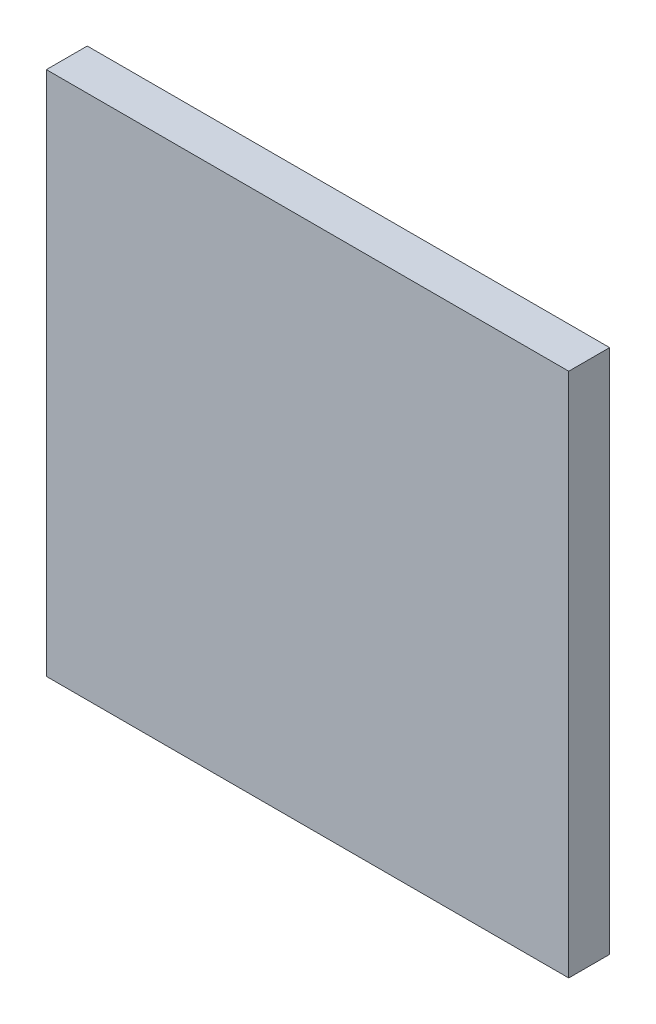
ISO-10303-21;
HEADER;
FILE_DESCRIPTION(('STEP AP214'),'2;1');
FILE_NAME('part.step','',(''),(''),'','','');
FILE_SCHEMA(('AUTOMOTIVE_DESIGN { 1 0 10303 214 1 1 1 1 }'));
ENDSEC;
DATA;
#1=APPLICATION_CONTEXT('core data for automotive mechanical design processes');
#2=APPLICATION_PROTOCOL_DEFINITION('international standard','automotive_design',2000,#1);
#3=PRODUCT_CONTEXT('',#1,'mechanical');
#4=PRODUCT('Part','Part','',(#3));
#5=PRODUCT_RELATED_PRODUCT_CATEGORY('part','',(#4));
#6=PRODUCT_DEFINITION_FORMATION('','',#4);
#7=PRODUCT_DEFINITION_CONTEXT('part definition',#1,'design');
#8=PRODUCT_DEFINITION('design','',#6,#7);
#9=PRODUCT_DEFINITION_SHAPE('','',#8);
#10=(LENGTH_UNIT() NAMED_UNIT(*) SI_UNIT(.MILLI.,.METRE.));
#11=(NAMED_UNIT(*) PLANE_ANGLE_UNIT() SI_UNIT($,.RADIAN.));
#12=(NAMED_UNIT(*) SI_UNIT($,.STERADIAN.) SOLID_ANGLE_UNIT());
#13=UNCERTAINTY_MEASURE_WITH_UNIT(LENGTH_MEASURE(1.E-05),#10,'distance_accuracy_value','');
#14=(GEOMETRIC_REPRESENTATION_CONTEXT(3) GLOBAL_UNCERTAINTY_ASSIGNED_CONTEXT((#13)) GLOBAL_UNIT_ASSIGNED_CONTEXT((#10,
#11,#12)) REPRESENTATION_CONTEXT('',''));
#15=CARTESIAN_POINT('',(0.,0.,0.));
#16=DIRECTION('',(0.,0.,1.));
#17=DIRECTION('',(1.,0.,0.));
#18=AXIS2_PLACEMENT_3D('',#15,#16,#17);
#19=CARTESIAN_POINT('',(-6.4262,-6.4262,1.));
#20=DIRECTION('',(1.,0.,0.));
#21=DIRECTION('',(0.,0.,-1.));
#22=AXIS2_PLACEMENT_3D('',#19,#20,#21);
#23=PLANE('',#22);
#24=DIRECTION('',(0.,-1.,0.));
#25=VECTOR('',#24,1.);
#26=CARTESIAN_POINT('',(-6.4262,-6.4262,0.));
#27=LINE('',#26,#25);
#28=CARTESIAN_POINT('',(-6.4262,6.4262,0.));
#29=VERTEX_POINT('',#28);
#30=CARTESIAN_POINT('',(-6.4262,-6.4262,0.));
#31=VERTEX_POINT('',#30);
#32=EDGE_CURVE('E96',#29,#31,#27,.T.);
#33=ORIENTED_EDGE('',*,*,#32,.T.);
#34=DIRECTION('',(0.,0.,-1.));
#35=VECTOR('',#34,1.);
#36=CARTESIAN_POINT('',(-6.4262,-6.4262,1.));
#37=LINE('',#36,#35);
#38=CARTESIAN_POINT('',(-6.4262,-6.4262,1.));
#39=VERTEX_POINT('',#38);
#40=EDGE_CURVE('E11',#39,#31,#37,.T.);
#41=ORIENTED_EDGE('',*,*,#40,.F.);
#42=DIRECTION('',(0.,-1.,0.));
#43=VECTOR('',#42,1.);
#44=CARTESIAN_POINT('',(-6.4262,-6.4262,1.));
#45=LINE('',#44,#43);
#46=CARTESIAN_POINT('',(-6.4262,6.4262,1.));
#47=VERTEX_POINT('',#46);
#48=EDGE_CURVE('E84',#47,#39,#45,.T.);
#49=ORIENTED_EDGE('',*,*,#48,.F.);
#50=DIRECTION('',(0.,0.,-1.));
#51=VECTOR('',#50,1.);
#52=CARTESIAN_POINT('',(-6.4262,6.4262,1.));
#53=LINE('',#52,#51);
#54=EDGE_CURVE('E92',#47,#29,#53,.T.);
#55=ORIENTED_EDGE('',*,*,#54,.T.);
#56=EDGE_LOOP('',(#33,#41,#49,#55));
#57=FACE_BOUND('',#56,.T.);
#58=ADVANCED_FACE('F33',(#57),#23,.F.);
#59=CARTESIAN_POINT('',(6.35,-6.4262,1.));
#60=DIRECTION('',(0.,1.,0.));
#61=DIRECTION('',(0.,0.,1.));
#62=AXIS2_PLACEMENT_3D('',#59,#60,#61);
#63=PLANE('',#62);
#64=DIRECTION('',(1.,0.,0.));
#65=VECTOR('',#64,1.);
#66=CARTESIAN_POINT('',(6.35,-6.4262,0.));
#67=LINE('',#66,#65);
#68=CARTESIAN_POINT('',(6.35,-6.4262,0.));
#69=VERTEX_POINT('',#68);
#70=EDGE_CURVE('E88',#31,#69,#67,.T.);
#71=ORIENTED_EDGE('',*,*,#70,.T.);
#72=DIRECTION('',(0.,0.,-1.));
#73=VECTOR('',#72,1.);
#74=CARTESIAN_POINT('',(6.35,-6.4262,1.));
#75=LINE('',#74,#73);
#76=CARTESIAN_POINT('',(6.35,-6.4262,1.));
#77=VERTEX_POINT('',#76);
#78=EDGE_CURVE('E41',#77,#69,#75,.T.);
#79=ORIENTED_EDGE('',*,*,#78,.F.);
#80=DIRECTION('',(1.,0.,0.));
#81=VECTOR('',#80,1.);
#82=CARTESIAN_POINT('',(6.35,-6.4262,1.));
#83=LINE('',#82,#81);
#84=EDGE_CURVE('E79',#39,#77,#83,.T.);
#85=ORIENTED_EDGE('',*,*,#84,.F.);
#86=ORIENTED_EDGE('',*,*,#40,.T.);
#87=EDGE_LOOP('',(#71,#79,#85,#86));
#88=FACE_BOUND('',#87,.T.);
#89=ADVANCED_FACE('F87',(#88),#63,.F.);
#90=CARTESIAN_POINT('',(6.35,6.4262,1.));
#91=DIRECTION('',(-1.,0.,0.));
#92=DIRECTION('',(0.,0.,1.));
#93=AXIS2_PLACEMENT_3D('',#90,#91,#92);
#94=PLANE('',#93);
#95=DIRECTION('',(0.,1.,0.));
#96=VECTOR('',#95,1.);
#97=CARTESIAN_POINT('',(6.35,6.4262,0.));
#98=LINE('',#97,#96);
#99=CARTESIAN_POINT('',(6.35,6.4262,0.));
#100=VERTEX_POINT('',#99);
#101=EDGE_CURVE('E66',#69,#100,#98,.T.);
#102=ORIENTED_EDGE('',*,*,#101,.T.);
#103=DIRECTION('',(0.,0.,-1.));
#104=VECTOR('',#103,1.);
#105=CARTESIAN_POINT('',(6.35,6.4262,1.));
#106=LINE('',#105,#104);
#107=CARTESIAN_POINT('',(6.35,6.4262,1.));
#108=VERTEX_POINT('',#107);
#109=EDGE_CURVE('E89',#108,#100,#106,.T.);
#110=ORIENTED_EDGE('',*,*,#109,.F.);
#111=DIRECTION('',(0.,1.,0.));
#112=VECTOR('',#111,1.);
#113=CARTESIAN_POINT('',(6.35,6.4262,1.));
#114=LINE('',#113,#112);
#115=EDGE_CURVE('E82',#77,#108,#114,.T.);
#116=ORIENTED_EDGE('',*,*,#115,.F.);
#117=ORIENTED_EDGE('',*,*,#78,.T.);
#118=EDGE_LOOP('',(#102,#110,#116,#117));
#119=FACE_BOUND('',#118,.T.);
#120=ADVANCED_FACE('F90',(#119),#94,.F.);
#121=CARTESIAN_POINT('',(-6.4262,6.4262,1.));
#122=DIRECTION('',(0.,-1.,0.));
#123=DIRECTION('',(0.,0.,-1.));
#124=AXIS2_PLACEMENT_3D('',#121,#122,#123);
#125=PLANE('',#124);
#126=DIRECTION('',(-1.,0.,0.));
#127=VECTOR('',#126,1.);
#128=CARTESIAN_POINT('',(-6.4262,6.4262,0.));
#129=LINE('',#128,#127);
#130=EDGE_CURVE('E72',#100,#29,#129,.T.);
#131=ORIENTED_EDGE('',*,*,#130,.T.);
#132=ORIENTED_EDGE('',*,*,#54,.F.);
#133=DIRECTION('',(-1.,0.,0.));
#134=VECTOR('',#133,1.);
#135=CARTESIAN_POINT('',(-6.4262,6.4262,1.));
#136=LINE('',#135,#134);
#137=EDGE_CURVE('E49',#108,#47,#136,.T.);
#138=ORIENTED_EDGE('',*,*,#137,.F.);
#139=ORIENTED_EDGE('',*,*,#109,.T.);
#140=EDGE_LOOP('',(#131,#132,#138,#139));
#141=FACE_BOUND('',#140,.T.);
#142=ADVANCED_FACE('F103',(#141),#125,.F.);
#143=CARTESIAN_POINT('',(0.,0.,1.));
#144=DIRECTION('',(0.,0.,-1.));
#145=DIRECTION('',(-1.,0.,0.));
#146=AXIS2_PLACEMENT_3D('',#143,#144,#145);
#147=PLANE('',#146);
#148=ORIENTED_EDGE('',*,*,#48,.T.);
#149=ORIENTED_EDGE('',*,*,#84,.T.);
#150=ORIENTED_EDGE('',*,*,#115,.T.);
#151=ORIENTED_EDGE('',*,*,#137,.T.);
#152=EDGE_LOOP('',(#148,#149,#150,#151));
#153=FACE_BOUND('',#152,.T.);
#154=ADVANCED_FACE('F80',(#153),#147,.F.);
#155=CARTESIAN_POINT('',(0.,0.,0.));
#156=DIRECTION('',(0.,0.,-1.));
#157=DIRECTION('',(-1.,0.,0.));
#158=AXIS2_PLACEMENT_3D('',#155,#156,#157);
#159=PLANE('',#158);
#160=ORIENTED_EDGE('',*,*,#32,.F.);
#161=ORIENTED_EDGE('',*,*,#130,.F.);
#162=ORIENTED_EDGE('',*,*,#101,.F.);
#163=ORIENTED_EDGE('',*,*,#70,.F.);
#164=EDGE_LOOP('',(#160,#161,#162,#163));
#165=FACE_BOUND('',#164,.T.);
#166=ADVANCED_FACE('F106',(#165),#159,.T.);
#167=CLOSED_SHELL('',(#58,#89,#120,#142,#154,#166));
#168=MANIFOLD_SOLID_BREP('B2',#167);
#169=ADVANCED_BREP_SHAPE_REPRESENTATION('',(#18,#168),#14);
#170=SHAPE_DEFINITION_REPRESENTATION(#9,#169);
ENDSEC;
END-ISO-10303-21;
